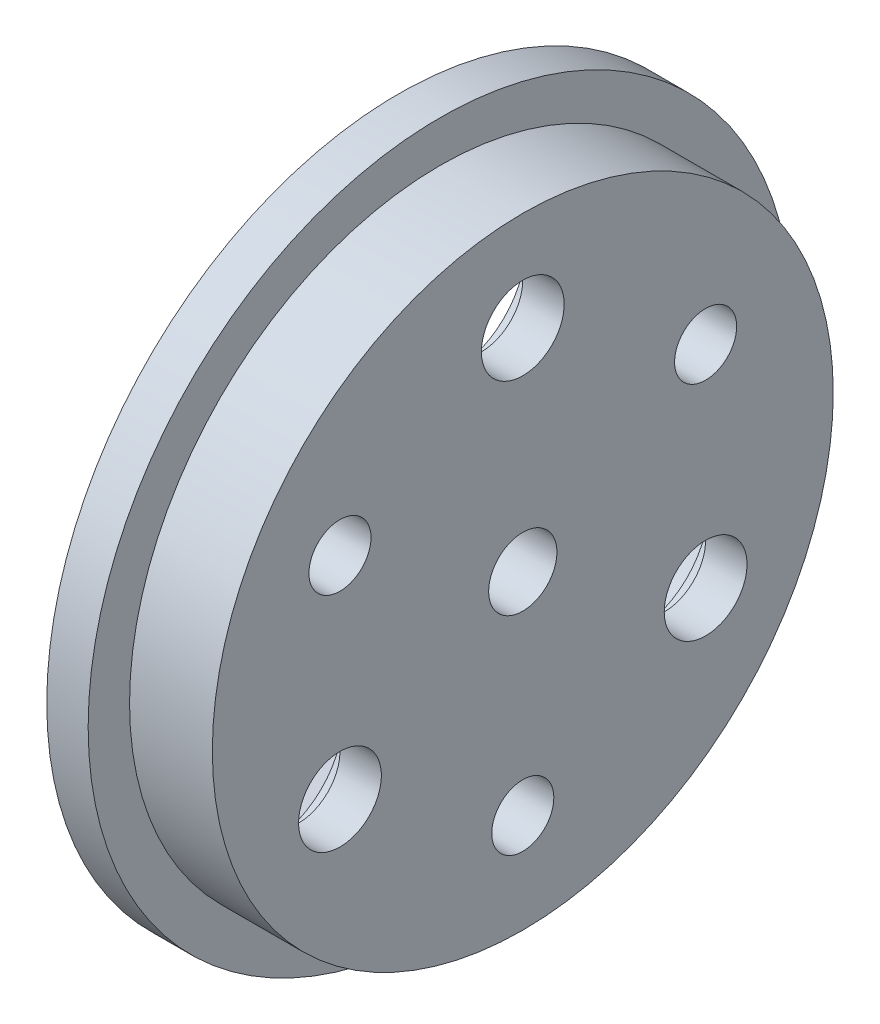
ISO-10303-21;
HEADER;
FILE_DESCRIPTION(('STEP AP214'),'2;1');
FILE_NAME('part.step','',(''),(''),'','','');
FILE_SCHEMA(('AUTOMOTIVE_DESIGN { 1 0 10303 214 1 1 1 1 }'));
ENDSEC;
DATA;
#1=APPLICATION_CONTEXT('core data for automotive mechanical design processes');
#2=APPLICATION_PROTOCOL_DEFINITION('international standard','automotive_design',2000,#1);
#3=PRODUCT_CONTEXT('',#1,'mechanical');
#4=PRODUCT('Part','Part','',(#3));
#5=PRODUCT_RELATED_PRODUCT_CATEGORY('part','',(#4));
#6=PRODUCT_DEFINITION_FORMATION('','',#4);
#7=PRODUCT_DEFINITION_CONTEXT('part definition',#1,'design');
#8=PRODUCT_DEFINITION('design','',#6,#7);
#9=PRODUCT_DEFINITION_SHAPE('','',#8);
#10=(LENGTH_UNIT() NAMED_UNIT(*) SI_UNIT(.MILLI.,.METRE.));
#11=(NAMED_UNIT(*) PLANE_ANGLE_UNIT() SI_UNIT($,.RADIAN.));
#12=(NAMED_UNIT(*) SI_UNIT($,.STERADIAN.) SOLID_ANGLE_UNIT());
#13=UNCERTAINTY_MEASURE_WITH_UNIT(LENGTH_MEASURE(1.E-05),#10,'distance_accuracy_value','');
#14=(GEOMETRIC_REPRESENTATION_CONTEXT(3) GLOBAL_UNCERTAINTY_ASSIGNED_CONTEXT((#13)) GLOBAL_UNIT_ASSIGNED_CONTEXT((#10,
#11,#12)) REPRESENTATION_CONTEXT('',''));
#15=CARTESIAN_POINT('',(0.,0.,0.));
#16=DIRECTION('',(0.,0.,1.));
#17=DIRECTION('',(1.,0.,0.));
#18=AXIS2_PLACEMENT_3D('',#15,#16,#17);
#19=CARTESIAN_POINT('',(2.6,-8.99999999999998,-9.52627944162879));
#20=DIRECTION('',(0.,-1.,0.));
#21=DIRECTION('',(0.,0.,-1.));
#22=AXIS2_PLACEMENT_3D('',#19,#20,#21);
#23=PLANE('',#22);
#24=DIRECTION('',(0.,0.,1.));
#25=VECTOR('',#24,1.);
#26=CARTESIAN_POINT('',(0.,-8.99999999999998,-9.52627944162879));
#27=LINE('',#26,#25);
#28=CARTESIAN_POINT('',(0.,-8.99999999999998,-9.52627944162879));
#29=VERTEX_POINT('',#28);
#30=CARTESIAN_POINT('',(0.,-8.99999999999999,-0.900000000001651));
#31=VERTEX_POINT('',#30);
#32=EDGE_CURVE('E144',#29,#31,#27,.T.);
#33=ORIENTED_EDGE('',*,*,#32,.T.);
#34=DIRECTION('',(1.,0.,0.));
#35=VECTOR('',#34,1.);
#36=CARTESIAN_POINT('',(0.,-8.99999999999999,-0.900000000001652));
#37=LINE('',#36,#35);
#38=CARTESIAN_POINT('',(2.6,-8.99999999999999,-0.900000000001651));
#39=VERTEX_POINT('',#38);
#40=EDGE_CURVE('E126',#31,#39,#37,.T.);
#41=ORIENTED_EDGE('',*,*,#40,.T.);
#42=DIRECTION('',(0.,0.,1.));
#43=VECTOR('',#42,1.);
#44=CARTESIAN_POINT('',(2.6,-8.99999999999998,-9.52627944162879));
#45=LINE('',#44,#43);
#46=CARTESIAN_POINT('',(2.6,-8.99999999999998,-9.52627944162879));
#47=VERTEX_POINT('',#46);
#48=EDGE_CURVE('E177',#47,#39,#45,.T.);
#49=ORIENTED_EDGE('',*,*,#48,.F.);
#50=DIRECTION('',(-1.,0.,0.));
#51=VECTOR('',#50,1.);
#52=CARTESIAN_POINT('',(2.6,-8.99999999999998,-9.52627944162879));
#53=LINE('',#52,#51);
#54=EDGE_CURVE('E150',#47,#29,#53,.T.);
#55=ORIENTED_EDGE('',*,*,#54,.T.);
#56=EDGE_LOOP('',(#33,#41,#49,#55));
#57=FACE_BOUND('',#56,.T.);
#58=ADVANCED_FACE('F40',(#57),#23,.F.);
#59=CARTESIAN_POINT('',(2.6,12.75,-3.03108891324556));
#60=DIRECTION('',(0.,0.500000000000001,-0.866025403784438));
#61=DIRECTION('',(0.,0.866025403784438,0.500000000000001));
#62=AXIS2_PLACEMENT_3D('',#59,#60,#61);
#63=PLANE('',#62);
#64=DIRECTION('',(0.,-0.866025403784438,-0.500000000000001));
#65=VECTOR('',#64,1.);
#66=CARTESIAN_POINT('',(0.,12.75,-3.03108891324556));
#67=LINE('',#66,#65);
#68=CARTESIAN_POINT('',(0.,12.75,-3.03108891324556));
#69=VERTEX_POINT('',#68);
#70=CARTESIAN_POINT('',(0.,5.27942286340726,-7.34422863405923));
#71=VERTEX_POINT('',#70);
#72=EDGE_CURVE('E244',#69,#71,#67,.T.);
#73=ORIENTED_EDGE('',*,*,#72,.T.);
#74=DIRECTION('',(1.,0.,0.));
#75=VECTOR('',#74,1.);
#76=CARTESIAN_POINT('',(0.,5.27942286340726,-7.34422863405923));
#77=LINE('',#76,#75);
#78=CARTESIAN_POINT('',(2.6,5.27942286340726,-7.34422863405923));
#79=VERTEX_POINT('',#78);
#80=EDGE_CURVE('E259',#71,#79,#77,.T.);
#81=ORIENTED_EDGE('',*,*,#80,.T.);
#82=DIRECTION('',(0.,-0.866025403784438,-0.500000000000001));
#83=VECTOR('',#82,1.);
#84=CARTESIAN_POINT('',(2.6,12.75,-3.03108891324556));
#85=LINE('',#84,#83);
#86=CARTESIAN_POINT('',(2.6,12.75,-3.03108891324556));
#87=VERTEX_POINT('',#86);
#88=EDGE_CURVE('E228',#87,#79,#85,.T.);
#89=ORIENTED_EDGE('',*,*,#88,.F.);
#90=DIRECTION('',(-1.,0.,0.));
#91=VECTOR('',#90,1.);
#92=CARTESIAN_POINT('',(2.6,12.75,-3.03108891324556));
#93=LINE('',#92,#91);
#94=EDGE_CURVE('E169',#87,#69,#93,.T.);
#95=ORIENTED_EDGE('',*,*,#94,.T.);
#96=EDGE_LOOP('',(#73,#81,#89,#95));
#97=FACE_BOUND('',#96,.T.);
#98=ADVANCED_FACE('F260',(#97),#63,.F.);
#99=CARTESIAN_POINT('',(2.6,-3.74999999999996,12.5573683548743));
#100=DIRECTION('',(0.,0.5,0.866025403784439));
#101=DIRECTION('',(0.,-0.866025403784439,0.5));
#102=AXIS2_PLACEMENT_3D('',#99,#100,#101);
#103=PLANE('',#102);
#104=DIRECTION('',(0.,0.866025403784439,-0.5));
#105=VECTOR('',#104,1.);
#106=CARTESIAN_POINT('',(0.,-3.74999999999996,12.5573683548743));
#107=LINE('',#106,#105);
#108=CARTESIAN_POINT('',(0.,-3.74999999999996,12.5573683548743));
#109=VERTEX_POINT('',#108);
#110=CARTESIAN_POINT('',(0.,3.72057713659398,8.24422863405995));
#111=VERTEX_POINT('',#110);
#112=EDGE_CURVE('E216',#109,#111,#107,.T.);
#113=ORIENTED_EDGE('',*,*,#112,.T.);
#114=DIRECTION('',(1.,0.,0.));
#115=VECTOR('',#114,1.);
#116=CARTESIAN_POINT('',(0.,3.72057713659398,8.24422863405995));
#117=LINE('',#116,#115);
#118=CARTESIAN_POINT('',(2.6,3.72057713659398,8.24422863405995));
#119=VERTEX_POINT('',#118);
#120=EDGE_CURVE('E204',#111,#119,#117,.T.);
#121=ORIENTED_EDGE('',*,*,#120,.T.);
#122=DIRECTION('',(0.,0.866025403784439,-0.5));
#123=VECTOR('',#122,1.);
#124=CARTESIAN_POINT('',(2.6,-3.74999999999996,12.5573683548743));
#125=LINE('',#124,#123);
#126=CARTESIAN_POINT('',(2.6,-3.74999999999996,12.5573683548743));
#127=VERTEX_POINT('',#126);
#128=EDGE_CURVE('E214',#127,#119,#125,.T.);
#129=ORIENTED_EDGE('',*,*,#128,.F.);
#130=DIRECTION('',(-1.,0.,0.));
#131=VECTOR('',#130,1.);
#132=CARTESIAN_POINT('',(2.6,-3.74999999999996,12.5573683548743));
#133=LINE('',#132,#131);
#134=EDGE_CURVE('E174',#127,#109,#133,.T.);
#135=ORIENTED_EDGE('',*,*,#134,.T.);
#136=EDGE_LOOP('',(#113,#121,#129,#135));
#137=FACE_BOUND('',#136,.T.);
#138=ADVANCED_FACE('F213',(#137),#103,.F.);
#139=CARTESIAN_POINT('',(2.,0.,0.));
#140=DIRECTION('',(-1.,0.,0.));
#141=DIRECTION('',(0.,0.,1.));
#142=AXIS2_PLACEMENT_3D('',#139,#140,#141);
#143=CYLINDRICAL_SURFACE('',#142,17.);
#144=CARTESIAN_POINT('',(2.,0.,0.));
#145=DIRECTION('',(1.,0.,0.));
#146=DIRECTION('',(0.,0.,-1.));
#147=AXIS2_PLACEMENT_3D('',#144,#145,#146);
#148=CIRCLE('',#147,17.);
#149=CARTESIAN_POINT('',(2.,0.,-17.));
#150=VERTEX_POINT('',#149);
#151=EDGE_CURVE('E184',#150,#150,#148,.T.);
#152=ORIENTED_EDGE('',*,*,#151,.F.);
#153=EDGE_LOOP('',(#152));
#154=FACE_BOUND('',#153,.T.);
#155=CARTESIAN_POINT('',(0.,0.,0.));
#156=DIRECTION('',(1.,0.,0.));
#157=DIRECTION('',(0.,0.,-1.));
#158=AXIS2_PLACEMENT_3D('',#155,#156,#157);
#159=CIRCLE('',#158,17.);
#160=CARTESIAN_POINT('',(0.,0.,-17.));
#161=VERTEX_POINT('',#160);
#162=EDGE_CURVE('E180',#161,#161,#159,.T.);
#163=ORIENTED_EDGE('',*,*,#162,.T.);
#164=EDGE_LOOP('',(#163));
#165=FACE_BOUND('',#164,.T.);
#166=ADVANCED_FACE('F42',(#154,#165),#143,.T.);
#167=CARTESIAN_POINT('',(2.,0.,0.));
#168=DIRECTION('',(1.,0.,0.));
#169=DIRECTION('',(0.,0.,-1.));
#170=AXIS2_PLACEMENT_3D('',#167,#168,#169);
#171=PLANE('',#170);
#172=CARTESIAN_POINT('',(2.,0.,0.));
#173=DIRECTION('',(1.,0.,0.));
#174=DIRECTION('',(0.,0.,-1.));
#175=AXIS2_PLACEMENT_3D('',#172,#173,#174);
#176=CIRCLE('',#175,15.);
#177=CARTESIAN_POINT('',(2.,0.,-15.));
#178=VERTEX_POINT('',#177);
#179=EDGE_CURVE('E181',#178,#178,#176,.T.);
#180=ORIENTED_EDGE('',*,*,#179,.F.);
#181=EDGE_LOOP('',(#180));
#182=FACE_BOUND('',#181,.T.);
#183=ORIENTED_EDGE('',*,*,#151,.T.);
#184=EDGE_LOOP('',(#183));
#185=FACE_BOUND('',#184,.T.);
#186=ADVANCED_FACE('F366',(#182,#185),#171,.T.);
#187=CARTESIAN_POINT('',(0.,0.,0.));
#188=DIRECTION('',(1.,0.,0.));
#189=DIRECTION('',(0.,0.,-1.));
#190=AXIS2_PLACEMENT_3D('',#187,#188,#189);
#191=PLANE('',#190);
#192=CARTESIAN_POINT('',(0.,3.72057713659391,-8.24422863406001));
#193=VERTEX_POINT('',#192);
#194=CARTESIAN_POINT('',(0.,-3.74999999999994,-12.5573683548743));
#195=VERTEX_POINT('',#194);
#196=EDGE_CURVE('E243',#193,#195,#67,.T.);
#197=ORIENTED_EDGE('',*,*,#196,.F.);
#198=CARTESIAN_POINT('',(0.,5.10000000000077,-8.83345911860127));
#199=DIRECTION('',(1.,0.,0.));
#200=DIRECTION('',(0.,0.,-1.));
#201=AXIS2_PLACEMENT_3D('',#198,#199,#200);
#202=CIRCLE('',#201,1.50000000000076);
#203=EDGE_CURVE('E341',#193,#71,#202,.T.);
#204=ORIENTED_EDGE('',*,*,#203,.T.);
#205=ORIENTED_EDGE('',*,*,#72,.F.);
#206=CARTESIAN_POINT('',(0.,11.,0.));
#207=DIRECTION('',(-1.,0.,0.));
#208=DIRECTION('',(0.,0.,-1.));
#209=AXIS2_PLACEMENT_3D('',#206,#207,#208);
#210=CIRCLE('',#209,3.5);
#211=CARTESIAN_POINT('',(0.,12.75,3.03108891324556));
#212=VERTEX_POINT('',#211);
#213=EDGE_CURVE('E241',#212,#69,#210,.T.);
#214=ORIENTED_EDGE('',*,*,#213,.F.);
#215=CARTESIAN_POINT('',(0.,5.27942286340596,7.34422863405996));
#216=VERTEX_POINT('',#215);
#217=EDGE_CURVE('E238',#216,#212,#107,.T.);
#218=ORIENTED_EDGE('',*,*,#217,.F.);
#219=CARTESIAN_POINT('',(0.,5.09999999999998,8.83345911860129));
#220=DIRECTION('',(1.,0.,0.));
#221=DIRECTION('',(0.,0.,-1.));
#222=AXIS2_PLACEMENT_3D('',#219,#220,#221);
#223=CIRCLE('',#222,1.5);
#224=EDGE_CURVE('E336',#216,#111,#223,.T.);
#225=ORIENTED_EDGE('',*,*,#224,.T.);
#226=ORIENTED_EDGE('',*,*,#112,.F.);
#227=CARTESIAN_POINT('',(0.,-5.5,9.52627944162881));
#228=DIRECTION('',(-1.,0.,0.));
#229=DIRECTION('',(0.,0.,1.));
#230=AXIS2_PLACEMENT_3D('',#227,#228,#229);
#231=CIRCLE('',#230,3.5);
#232=CARTESIAN_POINT('',(0.,-9.,9.52627944162876));
#233=VERTEX_POINT('',#232);
#234=EDGE_CURVE('E236',#233,#109,#231,.T.);
#235=ORIENTED_EDGE('',*,*,#234,.F.);
#236=CARTESIAN_POINT('',(0.,-9.,0.900000000000295));
#237=VERTEX_POINT('',#236);
#238=EDGE_CURVE('E146',#237,#233,#27,.T.);
#239=ORIENTED_EDGE('',*,*,#238,.F.);
#240=CARTESIAN_POINT('',(0.,-10.1999999999996,-6.79383794809744E-13));
#241=DIRECTION('',(1.,0.,0.));
#242=DIRECTION('',(0.,0.,-1.));
#243=AXIS2_PLACEMENT_3D('',#240,#241,#242);
#244=CIRCLE('',#243,1.5000000000003);
#245=EDGE_CURVE('E129',#237,#31,#244,.T.);
#246=ORIENTED_EDGE('',*,*,#245,.T.);
#247=ORIENTED_EDGE('',*,*,#32,.F.);
#248=CARTESIAN_POINT('',(0.,-5.49999999999999,-9.52627944162884));
#249=DIRECTION('',(-1.,0.,0.));
#250=DIRECTION('',(0.,0.,1.));
#251=AXIS2_PLACEMENT_3D('',#248,#249,#250);
#252=CIRCLE('',#251,3.5);
#253=EDGE_CURVE('E157',#195,#29,#252,.T.);
#254=ORIENTED_EDGE('',*,*,#253,.F.);
#255=EDGE_LOOP('',(#197,#204,#205,#214,#218,#225,#226,#235,#239,#246,#247,#254));
#256=FACE_BOUND('',#255,.T.);
#257=ORIENTED_EDGE('',*,*,#162,.F.);
#258=EDGE_LOOP('',(#257));
#259=FACE_BOUND('',#258,.T.);
#260=ADVANCED_FACE('F141',(#256,#259),#191,.F.);
#261=CARTESIAN_POINT('',(6.,0.,0.));
#262=DIRECTION('',(-1.,0.,0.));
#263=DIRECTION('',(0.,0.,1.));
#264=AXIS2_PLACEMENT_3D('',#261,#262,#263);
#265=CYLINDRICAL_SURFACE('',#264,15.);
#266=CARTESIAN_POINT('',(6.,0.,0.));
#267=DIRECTION('',(1.,0.,0.));
#268=DIRECTION('',(0.,0.,-1.));
#269=AXIS2_PLACEMENT_3D('',#266,#267,#268);
#270=CIRCLE('',#269,15.);
#271=CARTESIAN_POINT('',(6.,0.,-15.));
#272=VERTEX_POINT('',#271);
#273=EDGE_CURVE('E164',#272,#272,#270,.T.);
#274=ORIENTED_EDGE('',*,*,#273,.F.);
#275=EDGE_LOOP('',(#274));
#276=FACE_BOUND('',#275,.T.);
#277=ORIENTED_EDGE('',*,*,#179,.T.);
#278=EDGE_LOOP('',(#277));
#279=FACE_BOUND('',#278,.T.);
#280=ADVANCED_FACE('F361',(#276,#279),#265,.T.);
#281=CARTESIAN_POINT('',(6.,0.,0.));
#282=DIRECTION('',(1.,0.,0.));
#283=DIRECTION('',(0.,0.,-1.));
#284=AXIS2_PLACEMENT_3D('',#281,#282,#283);
#285=PLANE('',#284);
#286=CARTESIAN_POINT('',(6.,5.10000000000077,-8.83345911860127));
#287=DIRECTION('',(1.,0.,0.));
#288=DIRECTION('',(0.,0.,-1.));
#289=AXIS2_PLACEMENT_3D('',#286,#287,#288);
#290=CIRCLE('',#289,1.50000000000076);
#291=CARTESIAN_POINT('',(6.,5.10000000000077,-10.333459118602));
#292=VERTEX_POINT('',#291);
#293=EDGE_CURVE('E338',#292,#292,#290,.T.);
#294=ORIENTED_EDGE('',*,*,#293,.F.);
#295=EDGE_LOOP('',(#294));
#296=FACE_BOUND('',#295,.T.);
#297=CARTESIAN_POINT('',(6.,5.09999999999998,8.83345911860129));
#298=DIRECTION('',(1.,0.,0.));
#299=DIRECTION('',(0.,0.,-1.));
#300=AXIS2_PLACEMENT_3D('',#297,#298,#299);
#301=CIRCLE('',#300,1.5);
#302=CARTESIAN_POINT('',(6.,5.09999999999998,7.33345911860129));
#303=VERTEX_POINT('',#302);
#304=EDGE_CURVE('E147',#303,#303,#301,.T.);
#305=ORIENTED_EDGE('',*,*,#304,.F.);
#306=EDGE_LOOP('',(#305));
#307=FACE_BOUND('',#306,.T.);
#308=CARTESIAN_POINT('',(6.,-10.1999999999996,-6.79383794809744E-13));
#309=DIRECTION('',(1.,0.,0.));
#310=DIRECTION('',(0.,0.,-1.));
#311=AXIS2_PLACEMENT_3D('',#308,#309,#310);
#312=CIRCLE('',#311,1.5000000000003);
#313=CARTESIAN_POINT('',(6.,-10.1999999999996,-1.50000000000097));
#314=VERTEX_POINT('',#313);
#315=EDGE_CURVE('E148',#314,#314,#312,.T.);
#316=ORIENTED_EDGE('',*,*,#315,.F.);
#317=EDGE_LOOP('',(#316));
#318=FACE_BOUND('',#317,.T.);
#319=CARTESIAN_POINT('',(6.,0.,0.));
#320=DIRECTION('',(-1.,0.,0.));
#321=DIRECTION('',(0.,0.,1.));
#322=AXIS2_PLACEMENT_3D('',#319,#320,#321);
#323=CIRCLE('',#322,1.65);
#324=CARTESIAN_POINT('',(6.,0.,1.65));
#325=VERTEX_POINT('',#324);
#326=EDGE_CURVE('E264',#325,#325,#323,.T.);
#327=ORIENTED_EDGE('',*,*,#326,.T.);
#328=EDGE_LOOP('',(#327));
#329=FACE_BOUND('',#328,.T.);
#330=CARTESIAN_POINT('',(6.,-5.10000000000036,8.83345911860179));
#331=DIRECTION('',(-1.,0.,0.));
#332=DIRECTION('',(0.,0.,1.));
#333=AXIS2_PLACEMENT_3D('',#330,#331,#332);
#334=CIRCLE('',#333,2.);
#335=CARTESIAN_POINT('',(6.,-5.10000000000036,10.8334591186018));
#336=VERTEX_POINT('',#335);
#337=EDGE_CURVE('E193',#336,#336,#334,.T.);
#338=ORIENTED_EDGE('',*,*,#337,.T.);
#339=EDGE_LOOP('',(#338));
#340=FACE_BOUND('',#339,.T.);
#341=CARTESIAN_POINT('',(6.,10.2000000000006,0.));
#342=DIRECTION('',(-1.,0.,0.));
#343=DIRECTION('',(0.,0.,1.));
#344=AXIS2_PLACEMENT_3D('',#341,#342,#343);
#345=CIRCLE('',#344,2.);
#346=CARTESIAN_POINT('',(6.,10.2000000000006,2.00000000000001));
#347=VERTEX_POINT('',#346);
#348=EDGE_CURVE('E279',#347,#347,#345,.T.);
#349=ORIENTED_EDGE('',*,*,#348,.T.);
#350=EDGE_LOOP('',(#349));
#351=FACE_BOUND('',#350,.T.);
#352=CARTESIAN_POINT('',(6.,-5.10000000000022,-8.83345911860187));
#353=DIRECTION('',(-1.,0.,0.));
#354=DIRECTION('',(0.,0.,1.));
#355=AXIS2_PLACEMENT_3D('',#352,#353,#354);
#356=CIRCLE('',#355,2.);
#357=CARTESIAN_POINT('',(6.,-5.10000000000022,-6.83345911860187));
#358=VERTEX_POINT('',#357);
#359=EDGE_CURVE('E274',#358,#358,#356,.T.);
#360=ORIENTED_EDGE('',*,*,#359,.T.);
#361=EDGE_LOOP('',(#360));
#362=FACE_BOUND('',#361,.T.);
#363=ORIENTED_EDGE('',*,*,#273,.T.);
#364=EDGE_LOOP('',(#363));
#365=FACE_BOUND('',#364,.T.);
#366=ADVANCED_FACE('F330',(#296,#307,#318,#329,#340,#351,#362,#365),#285,.T.);
#367=CARTESIAN_POINT('',(2.6,-5.5,9.52627944162881));
#368=DIRECTION('',(-1.,0.,0.));
#369=DIRECTION('',(0.,0.,1.));
#370=AXIS2_PLACEMENT_3D('',#367,#368,#369);
#371=CYLINDRICAL_SURFACE('',#370,3.5);
#372=ORIENTED_EDGE('',*,*,#234,.T.);
#373=ORIENTED_EDGE('',*,*,#134,.F.);
#374=CARTESIAN_POINT('',(2.6,-5.5,9.52627944162881));
#375=DIRECTION('',(-1.,0.,0.));
#376=DIRECTION('',(0.,0.,1.));
#377=AXIS2_PLACEMENT_3D('',#374,#375,#376);
#378=CIRCLE('',#377,3.5);
#379=CARTESIAN_POINT('',(2.6,-9.,9.52627944162876));
#380=VERTEX_POINT('',#379);
#381=EDGE_CURVE('E152',#380,#127,#378,.T.);
#382=ORIENTED_EDGE('',*,*,#381,.F.);
#383=DIRECTION('',(-1.,0.,0.));
#384=VECTOR('',#383,1.);
#385=CARTESIAN_POINT('',(2.6,-9.,9.52627944162876));
#386=LINE('',#385,#384);
#387=EDGE_CURVE('E161',#380,#233,#386,.T.);
#388=ORIENTED_EDGE('',*,*,#387,.T.);
#389=EDGE_LOOP('',(#372,#373,#382,#388));
#390=FACE_BOUND('',#389,.T.);
#391=ADVANCED_FACE('F324',(#390),#371,.F.);
#392=CARTESIAN_POINT('',(2.6,-9.,0.900000000000295));
#393=VERTEX_POINT('',#392);
#394=EDGE_CURVE('E234',#393,#380,#45,.T.);
#395=ORIENTED_EDGE('',*,*,#394,.F.);
#396=DIRECTION('',(1.,0.,0.));
#397=VECTOR('',#396,1.);
#398=CARTESIAN_POINT('',(0.,-9.,0.900000000000296));
#399=LINE('',#398,#397);
#400=EDGE_CURVE('E55',#393,#237,#399,.F.);
#401=ORIENTED_EDGE('',*,*,#400,.T.);
#402=ORIENTED_EDGE('',*,*,#238,.T.);
#403=ORIENTED_EDGE('',*,*,#387,.F.);
#404=EDGE_LOOP('',(#395,#401,#402,#403));
#405=FACE_BOUND('',#404,.T.);
#406=ADVANCED_FACE('F317',(#405),#23,.F.);
#407=CARTESIAN_POINT('',(2.6,-5.49999999999999,-9.52627944162884));
#408=DIRECTION('',(-1.,0.,0.));
#409=DIRECTION('',(0.,0.,1.));
#410=AXIS2_PLACEMENT_3D('',#407,#408,#409);
#411=CYLINDRICAL_SURFACE('',#410,3.5);
#412=ORIENTED_EDGE('',*,*,#253,.T.);
#413=ORIENTED_EDGE('',*,*,#54,.F.);
#414=CARTESIAN_POINT('',(2.6,-5.49999999999999,-9.52627944162884));
#415=DIRECTION('',(-1.,0.,0.));
#416=DIRECTION('',(0.,0.,1.));
#417=AXIS2_PLACEMENT_3D('',#414,#415,#416);
#418=CIRCLE('',#417,3.5);
#419=CARTESIAN_POINT('',(2.6,-3.74999999999994,-12.5573683548743));
#420=VERTEX_POINT('',#419);
#421=EDGE_CURVE('E231',#420,#47,#418,.T.);
#422=ORIENTED_EDGE('',*,*,#421,.F.);
#423=DIRECTION('',(-1.,0.,0.));
#424=VECTOR('',#423,1.);
#425=CARTESIAN_POINT('',(2.6,-3.74999999999994,-12.5573683548743));
#426=LINE('',#425,#424);
#427=EDGE_CURVE('E166',#420,#195,#426,.T.);
#428=ORIENTED_EDGE('',*,*,#427,.T.);
#429=EDGE_LOOP('',(#412,#413,#422,#428));
#430=FACE_BOUND('',#429,.T.);
#431=ADVANCED_FACE('F256',(#430),#411,.F.);
#432=CARTESIAN_POINT('',(2.6,3.72057713659391,-8.24422863406001));
#433=VERTEX_POINT('',#432);
#434=EDGE_CURVE('E224',#433,#420,#85,.T.);
#435=ORIENTED_EDGE('',*,*,#434,.F.);
#436=DIRECTION('',(1.,0.,0.));
#437=VECTOR('',#436,1.);
#438=CARTESIAN_POINT('',(0.,3.72057713659391,-8.24422863406001));
#439=LINE('',#438,#437);
#440=EDGE_CURVE('E62',#433,#193,#439,.F.);
#441=ORIENTED_EDGE('',*,*,#440,.T.);
#442=ORIENTED_EDGE('',*,*,#196,.T.);
#443=ORIENTED_EDGE('',*,*,#427,.F.);
#444=EDGE_LOOP('',(#435,#441,#442,#443));
#445=FACE_BOUND('',#444,.T.);
#446=ADVANCED_FACE('F252',(#445),#63,.F.);
#447=CARTESIAN_POINT('',(2.6,11.,0.));
#448=DIRECTION('',(-1.,0.,0.));
#449=DIRECTION('',(0.,0.,1.));
#450=AXIS2_PLACEMENT_3D('',#447,#448,#449);
#451=CYLINDRICAL_SURFACE('',#450,3.5);
#452=ORIENTED_EDGE('',*,*,#213,.T.);
#453=ORIENTED_EDGE('',*,*,#94,.F.);
#454=CARTESIAN_POINT('',(2.6,11.,0.));
#455=DIRECTION('',(-1.,0.,0.));
#456=DIRECTION('',(0.,0.,-1.));
#457=AXIS2_PLACEMENT_3D('',#454,#455,#456);
#458=CIRCLE('',#457,3.5);
#459=CARTESIAN_POINT('',(2.6,12.75,3.03108891324556));
#460=VERTEX_POINT('',#459);
#461=EDGE_CURVE('E221',#460,#87,#458,.T.);
#462=ORIENTED_EDGE('',*,*,#461,.F.);
#463=DIRECTION('',(-1.,0.,0.));
#464=VECTOR('',#463,1.);
#465=CARTESIAN_POINT('',(2.6,12.75,3.03108891324556));
#466=LINE('',#465,#464);
#467=EDGE_CURVE('E171',#460,#212,#466,.T.);
#468=ORIENTED_EDGE('',*,*,#467,.T.);
#469=EDGE_LOOP('',(#452,#453,#462,#468));
#470=FACE_BOUND('',#469,.T.);
#471=ADVANCED_FACE('F312',(#470),#451,.F.);
#472=CARTESIAN_POINT('',(2.6,5.27942286340596,7.34422863405996));
#473=VERTEX_POINT('',#472);
#474=EDGE_CURVE('E155',#473,#460,#125,.T.);
#475=ORIENTED_EDGE('',*,*,#474,.F.);
#476=DIRECTION('',(1.,0.,0.));
#477=VECTOR('',#476,1.);
#478=CARTESIAN_POINT('',(0.,5.27942286340596,7.34422863405996));
#479=LINE('',#478,#477);
#480=EDGE_CURVE('E135',#473,#216,#479,.F.);
#481=ORIENTED_EDGE('',*,*,#480,.T.);
#482=ORIENTED_EDGE('',*,*,#217,.T.);
#483=ORIENTED_EDGE('',*,*,#467,.F.);
#484=EDGE_LOOP('',(#475,#481,#482,#483));
#485=FACE_BOUND('',#484,.T.);
#486=ADVANCED_FACE('F303',(#485),#103,.F.);
#487=CARTESIAN_POINT('',(2.6,-5.5,9.52627944162881));
#488=DIRECTION('',(-1.,0.,0.));
#489=DIRECTION('',(0.,0.,1.));
#490=AXIS2_PLACEMENT_3D('',#487,#488,#489);
#491=PLANE('',#490);
#492=CARTESIAN_POINT('',(2.6,5.10000000000077,-8.83345911860127));
#493=DIRECTION('',(-1.,0.,0.));
#494=DIRECTION('',(0.,0.,1.));
#495=AXIS2_PLACEMENT_3D('',#492,#493,#494);
#496=CIRCLE('',#495,1.50000000000076);
#497=EDGE_CURVE('E11',#433,#79,#496,.T.);
#498=ORIENTED_EDGE('',*,*,#497,.F.);
#499=ORIENTED_EDGE('',*,*,#434,.T.);
#500=ORIENTED_EDGE('',*,*,#421,.T.);
#501=ORIENTED_EDGE('',*,*,#48,.T.);
#502=CARTESIAN_POINT('',(2.6,-10.1999999999996,-6.79383794809744E-13));
#503=DIRECTION('',(-1.,0.,0.));
#504=DIRECTION('',(0.,0.,1.));
#505=AXIS2_PLACEMENT_3D('',#502,#503,#504);
#506=CIRCLE('',#505,1.5000000000003);
#507=EDGE_CURVE('E130',#393,#39,#506,.T.);
#508=ORIENTED_EDGE('',*,*,#507,.F.);
#509=ORIENTED_EDGE('',*,*,#394,.T.);
#510=ORIENTED_EDGE('',*,*,#381,.T.);
#511=ORIENTED_EDGE('',*,*,#128,.T.);
#512=CARTESIAN_POINT('',(2.6,5.09999999999998,8.83345911860129));
#513=DIRECTION('',(-1.,0.,0.));
#514=DIRECTION('',(0.,0.,1.));
#515=AXIS2_PLACEMENT_3D('',#512,#513,#514);
#516=CIRCLE('',#515,1.5);
#517=EDGE_CURVE('E48',#473,#119,#516,.T.);
#518=ORIENTED_EDGE('',*,*,#517,.F.);
#519=ORIENTED_EDGE('',*,*,#474,.T.);
#520=ORIENTED_EDGE('',*,*,#461,.T.);
#521=ORIENTED_EDGE('',*,*,#88,.T.);
#522=EDGE_LOOP('',(#498,#499,#500,#501,#508,#509,#510,#511,#518,#519,#520,#521));
#523=FACE_BOUND('',#522,.T.);
#524=CARTESIAN_POINT('',(2.6,0.,0.));
#525=DIRECTION('',(-1.,0.,0.));
#526=DIRECTION('',(0.,0.,1.));
#527=AXIS2_PLACEMENT_3D('',#524,#525,#526);
#528=CIRCLE('',#527,5.5);
#529=CARTESIAN_POINT('',(2.6,0.,5.5));
#530=VERTEX_POINT('',#529);
#531=EDGE_CURVE('E269',#530,#530,#528,.T.);
#532=ORIENTED_EDGE('',*,*,#531,.F.);
#533=EDGE_LOOP('',(#532));
#534=FACE_BOUND('',#533,.T.);
#535=CARTESIAN_POINT('',(2.6,-5.10000000000032,8.83345911860181));
#536=DIRECTION('',(-1.,0.,0.));
#537=DIRECTION('',(0.,0.,1.));
#538=AXIS2_PLACEMENT_3D('',#535,#536,#537);
#539=CIRCLE('',#538,3.54999999999986);
#540=CARTESIAN_POINT('',(2.6,-5.10000000000032,12.3834591186017));
#541=VERTEX_POINT('',#540);
#542=EDGE_CURVE('E286',#541,#541,#539,.T.);
#543=ORIENTED_EDGE('',*,*,#542,.F.);
#544=EDGE_LOOP('',(#543));
#545=FACE_BOUND('',#544,.T.);
#546=CARTESIAN_POINT('',(2.6,10.2000000000006,0.));
#547=DIRECTION('',(-1.,0.,0.));
#548=DIRECTION('',(0.,0.,1.));
#549=AXIS2_PLACEMENT_3D('',#546,#547,#548);
#550=CIRCLE('',#549,3.54999999999981);
#551=CARTESIAN_POINT('',(2.6,10.2000000000006,3.54999999999982));
#552=VERTEX_POINT('',#551);
#553=EDGE_CURVE('E292',#552,#552,#550,.T.);
#554=ORIENTED_EDGE('',*,*,#553,.F.);
#555=EDGE_LOOP('',(#554));
#556=FACE_BOUND('',#555,.T.);
#557=CARTESIAN_POINT('',(2.6,-5.10000000000031,-8.83345911860182));
#558=DIRECTION('',(-1.,0.,0.));
#559=DIRECTION('',(0.,0.,1.));
#560=AXIS2_PLACEMENT_3D('',#557,#558,#559);
#561=CIRCLE('',#560,3.54999999999991);
#562=CARTESIAN_POINT('',(2.6,-5.10000000000031,-5.28345911860191));
#563=VERTEX_POINT('',#562);
#564=EDGE_CURVE('E199',#563,#563,#561,.T.);
#565=ORIENTED_EDGE('',*,*,#564,.F.);
#566=EDGE_LOOP('',(#565));
#567=FACE_BOUND('',#566,.T.);
#568=ADVANCED_FACE('F218',(#523,#534,#545,#556,#567),#491,.T.);
#569=CARTESIAN_POINT('',(4.,-5.10000000000031,-8.83345911860182));
#570=DIRECTION('',(-1.,0.,0.));
#571=DIRECTION('',(0.,0.,1.));
#572=AXIS2_PLACEMENT_3D('',#569,#570,#571);
#573=CYLINDRICAL_SURFACE('',#572,3.54999999999991);
#574=CARTESIAN_POINT('',(4.,-5.10000000000031,-8.83345911860182));
#575=DIRECTION('',(-1.,0.,0.));
#576=DIRECTION('',(0.,0.,1.));
#577=AXIS2_PLACEMENT_3D('',#574,#575,#576);
#578=CIRCLE('',#577,3.54999999999991);
#579=CARTESIAN_POINT('',(4.,-5.10000000000031,-5.28345911860191));
#580=VERTEX_POINT('',#579);
#581=EDGE_CURVE('E295',#580,#580,#578,.T.);
#582=ORIENTED_EDGE('',*,*,#581,.F.);
#583=EDGE_LOOP('',(#582));
#584=FACE_BOUND('',#583,.T.);
#585=ORIENTED_EDGE('',*,*,#564,.T.);
#586=EDGE_LOOP('',(#585));
#587=FACE_BOUND('',#586,.T.);
#588=ADVANCED_FACE('F300',(#584,#587),#573,.F.);
#589=CARTESIAN_POINT('',(4.,0.,0.));
#590=DIRECTION('',(-1.,0.,0.));
#591=DIRECTION('',(0.,0.,1.));
#592=AXIS2_PLACEMENT_3D('',#589,#590,#591);
#593=PLANE('',#592);
#594=CARTESIAN_POINT('',(4.,-5.10000000000022,-8.83345911860187));
#595=DIRECTION('',(-1.,0.,0.));
#596=DIRECTION('',(0.,0.,1.));
#597=AXIS2_PLACEMENT_3D('',#594,#595,#596);
#598=CIRCLE('',#597,2.);
#599=CARTESIAN_POINT('',(4.,-5.10000000000022,-6.83345911860187));
#600=VERTEX_POINT('',#599);
#601=EDGE_CURVE('E196',#600,#600,#598,.T.);
#602=ORIENTED_EDGE('',*,*,#601,.F.);
#603=EDGE_LOOP('',(#602));
#604=FACE_BOUND('',#603,.T.);
#605=ORIENTED_EDGE('',*,*,#581,.T.);
#606=EDGE_LOOP('',(#605));
#607=FACE_BOUND('',#606,.T.);
#608=ADVANCED_FACE('F309',(#604,#607),#593,.T.);
#609=CARTESIAN_POINT('',(4.,10.2000000000006,0.));
#610=DIRECTION('',(-1.,0.,0.));
#611=DIRECTION('',(0.,0.,1.));
#612=AXIS2_PLACEMENT_3D('',#609,#610,#611);
#613=CYLINDRICAL_SURFACE('',#612,3.54999999999981);
#614=CARTESIAN_POINT('',(4.,10.2000000000006,0.));
#615=DIRECTION('',(-1.,0.,0.));
#616=DIRECTION('',(0.,0.,1.));
#617=AXIS2_PLACEMENT_3D('',#614,#615,#616);
#618=CIRCLE('',#617,3.54999999999981);
#619=CARTESIAN_POINT('',(4.,10.2000000000006,3.54999999999982));
#620=VERTEX_POINT('',#619);
#621=EDGE_CURVE('E289',#620,#620,#618,.T.);
#622=ORIENTED_EDGE('',*,*,#621,.F.);
#623=EDGE_LOOP('',(#622));
#624=FACE_BOUND('',#623,.T.);
#625=ORIENTED_EDGE('',*,*,#553,.T.);
#626=EDGE_LOOP('',(#625));
#627=FACE_BOUND('',#626,.T.);
#628=ADVANCED_FACE('F416',(#624,#627),#613,.F.);
#629=CARTESIAN_POINT('',(4.,0.,0.));
#630=DIRECTION('',(-1.,0.,0.));
#631=DIRECTION('',(0.,0.,1.));
#632=AXIS2_PLACEMENT_3D('',#629,#630,#631);
#633=PLANE('',#632);
#634=CARTESIAN_POINT('',(4.,10.2000000000006,0.));
#635=DIRECTION('',(-1.,0.,0.));
#636=DIRECTION('',(0.,0.,1.));
#637=AXIS2_PLACEMENT_3D('',#634,#635,#636);
#638=CIRCLE('',#637,2.);
#639=CARTESIAN_POINT('',(4.,10.2000000000006,2.00000000000001));
#640=VERTEX_POINT('',#639);
#641=EDGE_CURVE('E192',#640,#640,#638,.T.);
#642=ORIENTED_EDGE('',*,*,#641,.F.);
#643=EDGE_LOOP('',(#642));
#644=FACE_BOUND('',#643,.T.);
#645=ORIENTED_EDGE('',*,*,#621,.T.);
#646=EDGE_LOOP('',(#645));
#647=FACE_BOUND('',#646,.T.);
#648=ADVANCED_FACE('F421',(#644,#647),#633,.T.);
#649=CARTESIAN_POINT('',(4.,-5.10000000000032,8.83345911860181));
#650=DIRECTION('',(-1.,0.,0.));
#651=DIRECTION('',(0.,0.,1.));
#652=AXIS2_PLACEMENT_3D('',#649,#650,#651);
#653=CYLINDRICAL_SURFACE('',#652,3.54999999999986);
#654=CARTESIAN_POINT('',(4.,-5.10000000000032,8.83345911860181));
#655=DIRECTION('',(-1.,0.,0.));
#656=DIRECTION('',(0.,0.,1.));
#657=AXIS2_PLACEMENT_3D('',#654,#655,#656);
#658=CIRCLE('',#657,3.54999999999986);
#659=CARTESIAN_POINT('',(4.,-5.10000000000032,12.3834591186017));
#660=VERTEX_POINT('',#659);
#661=EDGE_CURVE('E239',#660,#660,#658,.T.);
#662=ORIENTED_EDGE('',*,*,#661,.F.);
#663=EDGE_LOOP('',(#662));
#664=FACE_BOUND('',#663,.T.);
#665=ORIENTED_EDGE('',*,*,#542,.T.);
#666=EDGE_LOOP('',(#665));
#667=FACE_BOUND('',#666,.T.);
#668=ADVANCED_FACE('F429',(#664,#667),#653,.F.);
#669=CARTESIAN_POINT('',(4.,0.,0.));
#670=DIRECTION('',(-1.,0.,0.));
#671=DIRECTION('',(0.,0.,1.));
#672=AXIS2_PLACEMENT_3D('',#669,#670,#671);
#673=PLANE('',#672);
#674=CARTESIAN_POINT('',(4.,-5.10000000000036,8.83345911860179));
#675=DIRECTION('',(-1.,0.,0.));
#676=DIRECTION('',(0.,0.,1.));
#677=AXIS2_PLACEMENT_3D('',#674,#675,#676);
#678=CIRCLE('',#677,2.);
#679=CARTESIAN_POINT('',(4.,-5.10000000000036,10.8334591186018));
#680=VERTEX_POINT('',#679);
#681=EDGE_CURVE('E189',#680,#680,#678,.T.);
#682=ORIENTED_EDGE('',*,*,#681,.F.);
#683=EDGE_LOOP('',(#682));
#684=FACE_BOUND('',#683,.T.);
#685=ORIENTED_EDGE('',*,*,#661,.T.);
#686=EDGE_LOOP('',(#685));
#687=FACE_BOUND('',#686,.T.);
#688=ADVANCED_FACE('F434',(#684,#687),#673,.T.);
#689=CARTESIAN_POINT('',(6.,-5.10000000000036,8.83345911860179));
#690=DIRECTION('',(-1.,0.,0.));
#691=DIRECTION('',(0.,0.,1.));
#692=AXIS2_PLACEMENT_3D('',#689,#690,#691);
#693=CYLINDRICAL_SURFACE('',#692,2.);
#694=ORIENTED_EDGE('',*,*,#681,.T.);
#695=EDGE_LOOP('',(#694));
#696=FACE_BOUND('',#695,.T.);
#697=ORIENTED_EDGE('',*,*,#337,.F.);
#698=EDGE_LOOP('',(#697));
#699=FACE_BOUND('',#698,.T.);
#700=ADVANCED_FACE('F458',(#696,#699),#693,.F.);
#701=CARTESIAN_POINT('',(6.,10.2000000000006,0.));
#702=DIRECTION('',(-1.,0.,0.));
#703=DIRECTION('',(0.,0.,1.));
#704=AXIS2_PLACEMENT_3D('',#701,#702,#703);
#705=CYLINDRICAL_SURFACE('',#704,2.);
#706=ORIENTED_EDGE('',*,*,#641,.T.);
#707=EDGE_LOOP('',(#706));
#708=FACE_BOUND('',#707,.T.);
#709=ORIENTED_EDGE('',*,*,#348,.F.);
#710=EDGE_LOOP('',(#709));
#711=FACE_BOUND('',#710,.T.);
#712=ADVANCED_FACE('F468',(#708,#711),#705,.F.);
#713=CARTESIAN_POINT('',(6.,-5.10000000000022,-8.83345911860187));
#714=DIRECTION('',(-1.,0.,0.));
#715=DIRECTION('',(0.,0.,1.));
#716=AXIS2_PLACEMENT_3D('',#713,#714,#715);
#717=CYLINDRICAL_SURFACE('',#716,2.);
#718=ORIENTED_EDGE('',*,*,#601,.T.);
#719=EDGE_LOOP('',(#718));
#720=FACE_BOUND('',#719,.T.);
#721=ORIENTED_EDGE('',*,*,#359,.F.);
#722=EDGE_LOOP('',(#721));
#723=FACE_BOUND('',#722,.T.);
#724=ADVANCED_FACE('F478',(#720,#723),#717,.F.);
#725=CARTESIAN_POINT('',(3.6,0.,0.));
#726=DIRECTION('',(-1.,0.,0.));
#727=DIRECTION('',(0.,0.,1.));
#728=AXIS2_PLACEMENT_3D('',#725,#726,#727);
#729=CYLINDRICAL_SURFACE('',#728,5.5);
#730=CARTESIAN_POINT('',(3.6,0.,0.));
#731=DIRECTION('',(-1.,0.,0.));
#732=DIRECTION('',(0.,0.,1.));
#733=AXIS2_PLACEMENT_3D('',#730,#731,#732);
#734=CIRCLE('',#733,5.5);
#735=CARTESIAN_POINT('',(3.6,0.,5.5));
#736=VERTEX_POINT('',#735);
#737=EDGE_CURVE('E271',#736,#736,#734,.T.);
#738=ORIENTED_EDGE('',*,*,#737,.F.);
#739=EDGE_LOOP('',(#738));
#740=FACE_BOUND('',#739,.T.);
#741=ORIENTED_EDGE('',*,*,#531,.T.);
#742=EDGE_LOOP('',(#741));
#743=FACE_BOUND('',#742,.T.);
#744=ADVANCED_FACE('F488',(#740,#743),#729,.F.);
#745=CARTESIAN_POINT('',(3.6,0.,0.));
#746=DIRECTION('',(-1.,0.,0.));
#747=DIRECTION('',(0.,0.,1.));
#748=AXIS2_PLACEMENT_3D('',#745,#746,#747);
#749=PLANE('',#748);
#750=CARTESIAN_POINT('',(3.6,0.,0.));
#751=DIRECTION('',(-1.,0.,0.));
#752=DIRECTION('',(0.,0.,1.));
#753=AXIS2_PLACEMENT_3D('',#750,#751,#752);
#754=CIRCLE('',#753,1.65);
#755=CARTESIAN_POINT('',(3.6,0.,1.65));
#756=VERTEX_POINT('',#755);
#757=EDGE_CURVE('E261',#756,#756,#754,.T.);
#758=ORIENTED_EDGE('',*,*,#757,.F.);
#759=EDGE_LOOP('',(#758));
#760=FACE_BOUND('',#759,.T.);
#761=ORIENTED_EDGE('',*,*,#737,.T.);
#762=EDGE_LOOP('',(#761));
#763=FACE_BOUND('',#762,.T.);
#764=ADVANCED_FACE('F498',(#760,#763),#749,.T.);
#765=CARTESIAN_POINT('',(6.,0.,0.));
#766=DIRECTION('',(-1.,0.,0.));
#767=DIRECTION('',(0.,0.,1.));
#768=AXIS2_PLACEMENT_3D('',#765,#766,#767);
#769=CYLINDRICAL_SURFACE('',#768,1.65);
#770=ORIENTED_EDGE('',*,*,#326,.F.);
#771=EDGE_LOOP('',(#770));
#772=FACE_BOUND('',#771,.T.);
#773=ORIENTED_EDGE('',*,*,#757,.T.);
#774=EDGE_LOOP('',(#773));
#775=FACE_BOUND('',#774,.T.);
#776=ADVANCED_FACE('F508',(#772,#775),#769,.F.);
#777=CARTESIAN_POINT('',(0.,-10.1999999999996,-6.79383794809744E-13));
#778=DIRECTION('',(1.,0.,0.));
#779=DIRECTION('',(0.,0.,-1.));
#780=AXIS2_PLACEMENT_3D('',#777,#778,#779);
#781=CYLINDRICAL_SURFACE('',#780,1.5000000000003);
#782=ORIENTED_EDGE('',*,*,#315,.T.);
#783=EDGE_LOOP('',(#782));
#784=FACE_BOUND('',#783,.T.);
#785=ORIENTED_EDGE('',*,*,#245,.F.);
#786=ORIENTED_EDGE('',*,*,#400,.F.);
#787=ORIENTED_EDGE('',*,*,#507,.T.);
#788=ORIENTED_EDGE('',*,*,#40,.F.);
#789=EDGE_LOOP('',(#785,#786,#787,#788));
#790=FACE_BOUND('',#789,.T.);
#791=ADVANCED_FACE('F128',(#784,#790),#781,.F.);
#792=CARTESIAN_POINT('',(0.,5.09999999999998,8.83345911860129));
#793=DIRECTION('',(1.,0.,0.));
#794=DIRECTION('',(0.,0.,-1.));
#795=AXIS2_PLACEMENT_3D('',#792,#793,#794);
#796=CYLINDRICAL_SURFACE('',#795,1.5);
#797=ORIENTED_EDGE('',*,*,#304,.T.);
#798=EDGE_LOOP('',(#797));
#799=FACE_BOUND('',#798,.T.);
#800=ORIENTED_EDGE('',*,*,#224,.F.);
#801=ORIENTED_EDGE('',*,*,#480,.F.);
#802=ORIENTED_EDGE('',*,*,#517,.T.);
#803=ORIENTED_EDGE('',*,*,#120,.F.);
#804=EDGE_LOOP('',(#800,#801,#802,#803));
#805=FACE_BOUND('',#804,.T.);
#806=ADVANCED_FACE('F203',(#799,#805),#796,.F.);
#807=CARTESIAN_POINT('',(0.,5.10000000000077,-8.83345911860127));
#808=DIRECTION('',(1.,0.,0.));
#809=DIRECTION('',(0.,0.,-1.));
#810=AXIS2_PLACEMENT_3D('',#807,#808,#809);
#811=CYLINDRICAL_SURFACE('',#810,1.50000000000076);
#812=ORIENTED_EDGE('',*,*,#293,.T.);
#813=EDGE_LOOP('',(#812));
#814=FACE_BOUND('',#813,.T.);
#815=ORIENTED_EDGE('',*,*,#203,.F.);
#816=ORIENTED_EDGE('',*,*,#440,.F.);
#817=ORIENTED_EDGE('',*,*,#497,.T.);
#818=ORIENTED_EDGE('',*,*,#80,.F.);
#819=EDGE_LOOP('',(#815,#816,#817,#818));
#820=FACE_BOUND('',#819,.T.);
#821=ADVANCED_FACE('F258',(#814,#820),#811,.F.);
#822=CLOSED_SHELL('',(#58,#98,#138,#166,#186,#260,#280,#366,#391,#406,#431,#446,#471,#486,#568,
#588,#608,#628,#648,#668,#688,#700,#712,#724,#744,#764,#776,#791,#806,#821));
#823=MANIFOLD_SOLID_BREP('B2',#822);
#824=ADVANCED_BREP_SHAPE_REPRESENTATION('',(#18,#823),#14);
#825=SHAPE_DEFINITION_REPRESENTATION(#9,#824);
ENDSEC;
END-ISO-10303-21;
